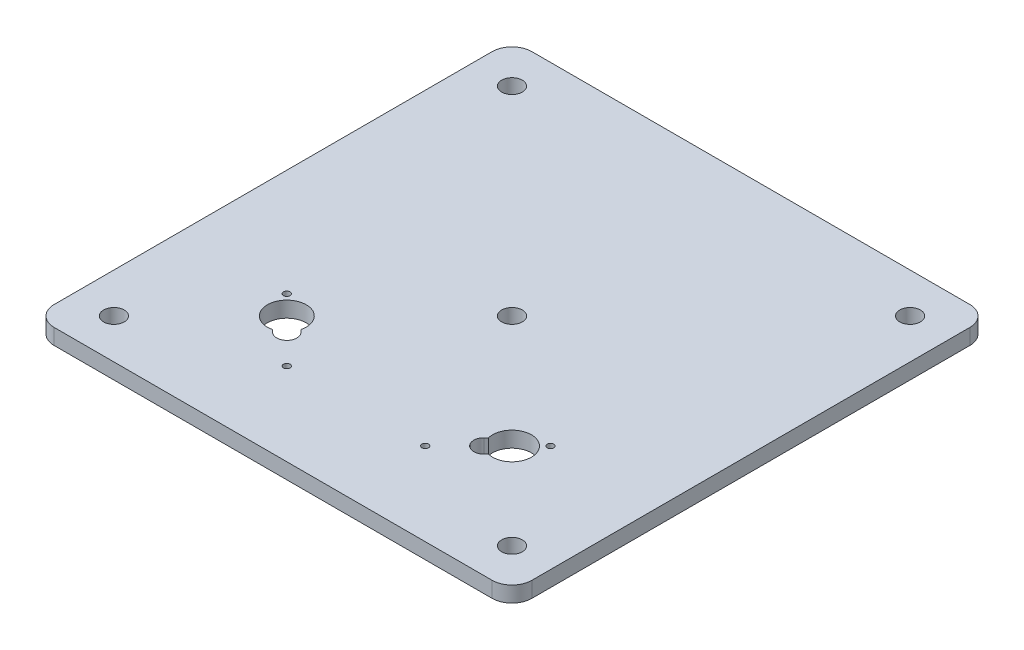
ISO-10303-21;
HEADER;
FILE_DESCRIPTION(('STEP AP214'),'2;1');
FILE_NAME('part.step','',(''),(''),'','','');
FILE_SCHEMA(('AUTOMOTIVE_DESIGN { 1 0 10303 214 1 1 1 1 }'));
ENDSEC;
DATA;
#1=APPLICATION_CONTEXT('core data for automotive mechanical design processes');
#2=APPLICATION_PROTOCOL_DEFINITION('international standard','automotive_design',2000,#1);
#3=PRODUCT_CONTEXT('',#1,'mechanical');
#4=PRODUCT('Part','Part','',(#3));
#5=PRODUCT_RELATED_PRODUCT_CATEGORY('part','',(#4));
#6=PRODUCT_DEFINITION_FORMATION('','',#4);
#7=PRODUCT_DEFINITION_CONTEXT('part definition',#1,'design');
#8=PRODUCT_DEFINITION('design','',#6,#7);
#9=PRODUCT_DEFINITION_SHAPE('','',#8);
#10=(LENGTH_UNIT() NAMED_UNIT(*) SI_UNIT(.MILLI.,.METRE.));
#11=(NAMED_UNIT(*) PLANE_ANGLE_UNIT() SI_UNIT($,.RADIAN.));
#12=(NAMED_UNIT(*) SI_UNIT($,.STERADIAN.) SOLID_ANGLE_UNIT());
#13=UNCERTAINTY_MEASURE_WITH_UNIT(LENGTH_MEASURE(1.E-05),#10,'distance_accuracy_value','');
#14=(GEOMETRIC_REPRESENTATION_CONTEXT(3) GLOBAL_UNCERTAINTY_ASSIGNED_CONTEXT((#13)) GLOBAL_UNIT_ASSIGNED_CONTEXT((#10,
#11,#12)) REPRESENTATION_CONTEXT('',''));
#15=CARTESIAN_POINT('',(0.,0.,0.));
#16=DIRECTION('',(0.,0.,1.));
#17=DIRECTION('',(1.,0.,0.));
#18=AXIS2_PLACEMENT_3D('',#15,#16,#17);
#19=CARTESIAN_POINT('',(-69.85,5.,69.85));
#20=DIRECTION('',(0.,1.,0.));
#21=DIRECTION('',(0.,0.,1.));
#22=AXIS2_PLACEMENT_3D('',#19,#20,#21);
#23=PLANE('',#22);
#24=CARTESIAN_POINT('',(-22.0794092425505,5.,49.7626397260038));
#25=DIRECTION('',(0.,1.,0.));
#26=DIRECTION('',(0.,0.,1.));
#27=AXIS2_PLACEMENT_3D('',#24,#25,#26);
#28=CIRCLE('',#27,1.05000000000001);
#29=CARTESIAN_POINT('',(-22.0794092425505,5.,50.8126397260038));
#30=VERTEX_POINT('',#29);
#31=EDGE_CURVE('E194',#30,#30,#28,.T.);
#32=ORIENTED_EDGE('',*,*,#31,.F.);
#33=EDGE_LOOP('',(#32));
#34=FACE_BOUND('',#33,.T.);
#35=CARTESIAN_POINT('',(42.0551758110702,5.,29.7868731574836));
#36=DIRECTION('',(0.,1.,0.));
#37=DIRECTION('',(0.,0.,-1.));
#38=AXIS2_PLACEMENT_3D('',#35,#36,#37);
#39=CIRCLE('',#38,1.05);
#40=CARTESIAN_POINT('',(42.0551758110702,5.,28.7368731574836));
#41=VERTEX_POINT('',#40);
#42=EDGE_CURVE('E206',#41,#41,#39,.T.);
#43=ORIENTED_EDGE('',*,*,#42,.F.);
#44=EDGE_LOOP('',(#43));
#45=FACE_BOUND('',#44,.T.);
#46=CARTESIAN_POINT('',(-63.5,5.,-63.5));
#47=DIRECTION('',(0.,1.,0.));
#48=DIRECTION('',(0.,0.,-1.));
#49=AXIS2_PLACEMENT_3D('',#46,#47,#48);
#50=CIRCLE('',#49,3.302);
#51=CARTESIAN_POINT('',(-63.5,5.,-66.802));
#52=VERTEX_POINT('',#51);
#53=EDGE_CURVE('E246',#52,#52,#50,.T.);
#54=ORIENTED_EDGE('',*,*,#53,.F.);
#55=EDGE_LOOP('',(#54));
#56=FACE_BOUND('',#55,.T.);
#57=CARTESIAN_POINT('',(63.5000000000001,5.,63.5));
#58=DIRECTION('',(0.,1.,0.));
#59=DIRECTION('',(0.,0.,-1.));
#60=AXIS2_PLACEMENT_3D('',#57,#58,#59);
#61=CIRCLE('',#60,3.302);
#62=CARTESIAN_POINT('',(63.5000000000001,5.,60.198));
#63=VERTEX_POINT('',#62);
#64=EDGE_CURVE('E258',#63,#63,#61,.T.);
#65=ORIENTED_EDGE('',*,*,#64,.F.);
#66=EDGE_LOOP('',(#65));
#67=FACE_BOUND('',#66,.T.);
#68=CARTESIAN_POINT('',(-69.85,5.,69.85));
#69=DIRECTION('',(0.,1.,0.));
#70=DIRECTION('',(0.,0.,1.));
#71=AXIS2_PLACEMENT_3D('',#68,#69,#70);
#72=CIRCLE('',#71,6.34999999999999);
#73=CARTESIAN_POINT('',(-76.2,5.,69.85));
#74=VERTEX_POINT('',#73);
#75=CARTESIAN_POINT('',(-69.85,5.,76.2));
#76=VERTEX_POINT('',#75);
#77=EDGE_CURVE('E270',#74,#76,#72,.T.);
#78=ORIENTED_EDGE('',*,*,#77,.T.);
#79=DIRECTION('',(1.,0.,0.));
#80=VECTOR('',#79,1.);
#81=CARTESIAN_POINT('',(-69.85,5.,76.2));
#82=LINE('',#81,#80);
#83=CARTESIAN_POINT('',(69.85,5.,76.2));
#84=VERTEX_POINT('',#83);
#85=EDGE_CURVE('E273',#76,#84,#82,.T.);
#86=ORIENTED_EDGE('',*,*,#85,.T.);
#87=CARTESIAN_POINT('',(69.85,5.,69.85));
#88=DIRECTION('',(0.,1.,0.));
#89=DIRECTION('',(0.,0.,1.));
#90=AXIS2_PLACEMENT_3D('',#87,#88,#89);
#91=CIRCLE('',#90,6.34999999999999);
#92=CARTESIAN_POINT('',(76.2,5.,69.85));
#93=VERTEX_POINT('',#92);
#94=EDGE_CURVE('E276',#84,#93,#91,.T.);
#95=ORIENTED_EDGE('',*,*,#94,.T.);
#96=DIRECTION('',(0.,0.,-1.));
#97=VECTOR('',#96,1.);
#98=CARTESIAN_POINT('',(76.2,5.,-69.85));
#99=LINE('',#98,#97);
#100=CARTESIAN_POINT('',(76.2,5.,-69.85));
#101=VERTEX_POINT('',#100);
#102=EDGE_CURVE('E278',#93,#101,#99,.T.);
#103=ORIENTED_EDGE('',*,*,#102,.T.);
#104=CARTESIAN_POINT('',(69.85,5.,-69.85));
#105=DIRECTION('',(0.,1.,0.));
#106=DIRECTION('',(0.,0.,-1.));
#107=AXIS2_PLACEMENT_3D('',#104,#105,#106);
#108=CIRCLE('',#107,6.34999999999999);
#109=CARTESIAN_POINT('',(69.8499999999999,5.,-76.2));
#110=VERTEX_POINT('',#109);
#111=EDGE_CURVE('E280',#101,#110,#108,.T.);
#112=ORIENTED_EDGE('',*,*,#111,.T.);
#113=DIRECTION('',(-1.,0.,0.));
#114=VECTOR('',#113,1.);
#115=CARTESIAN_POINT('',(-69.85,5.,-76.2));
#116=LINE('',#115,#114);
#117=CARTESIAN_POINT('',(-69.85,5.,-76.2));
#118=VERTEX_POINT('',#117);
#119=EDGE_CURVE('E282',#110,#118,#116,.T.);
#120=ORIENTED_EDGE('',*,*,#119,.T.);
#121=CARTESIAN_POINT('',(-69.8500000000001,5.,-69.85));
#122=DIRECTION('',(0.,1.,0.));
#123=DIRECTION('',(0.,0.,1.));
#124=AXIS2_PLACEMENT_3D('',#121,#122,#123);
#125=CIRCLE('',#124,6.34999999999999);
#126=CARTESIAN_POINT('',(-76.2,5.,-69.85));
#127=VERTEX_POINT('',#126);
#128=EDGE_CURVE('E284',#118,#127,#125,.T.);
#129=ORIENTED_EDGE('',*,*,#128,.T.);
#130=DIRECTION('',(0.,0.,1.));
#131=VECTOR('',#130,1.);
#132=CARTESIAN_POINT('',(-76.2,5.,-69.85));
#133=LINE('',#132,#131);
#134=EDGE_CURVE('E286',#127,#74,#133,.T.);
#135=ORIENTED_EDGE('',*,*,#134,.T.);
#136=EDGE_LOOP('',(#78,#86,#95,#103,#112,#120,#129,#135));
#137=FACE_BOUND('',#136,.T.);
#138=CARTESIAN_POINT('',(63.5000000000001,5.,-63.5));
#139=DIRECTION('',(0.,1.,0.));
#140=DIRECTION('',(0.,0.,1.));
#141=AXIS2_PLACEMENT_3D('',#138,#139,#140);
#142=CIRCLE('',#141,3.302);
#143=CARTESIAN_POINT('',(63.5000000000001,5.,-60.198));
#144=VERTEX_POINT('',#143);
#145=EDGE_CURVE('E264',#144,#144,#142,.T.);
#146=ORIENTED_EDGE('',*,*,#145,.F.);
#147=EDGE_LOOP('',(#146));
#148=FACE_BOUND('',#147,.T.);
#149=CARTESIAN_POINT('',(-63.5,5.,63.5));
#150=DIRECTION('',(0.,1.,0.));
#151=DIRECTION('',(0.,0.,1.));
#152=AXIS2_PLACEMENT_3D('',#149,#150,#151);
#153=CIRCLE('',#152,3.302);
#154=CARTESIAN_POINT('',(-63.5,5.,66.802));
#155=VERTEX_POINT('',#154);
#156=EDGE_CURVE('E252',#155,#155,#153,.T.);
#157=ORIENTED_EDGE('',*,*,#156,.F.);
#158=EDGE_LOOP('',(#157));
#159=FACE_BOUND('',#158,.T.);
#160=CARTESIAN_POINT('',(0.,5.,0.));
#161=DIRECTION('',(0.,1.,0.));
#162=DIRECTION('',(0.,0.,1.));
#163=AXIS2_PLACEMENT_3D('',#160,#161,#162);
#164=CIRCLE('',#163,3.302);
#165=CARTESIAN_POINT('',(0.,5.,3.30199999999997));
#166=VERTEX_POINT('',#165);
#167=EDGE_CURVE('E240',#166,#166,#164,.T.);
#168=ORIENTED_EDGE('',*,*,#167,.F.);
#169=EDGE_LOOP('',(#168));
#170=FACE_BOUND('',#169,.T.);
#171=DIRECTION('',(0.707106781186548,0.,0.707106781186548));
#172=VECTOR('',#171,1.);
#173=CARTESIAN_POINT('',(-33.6936381235396,5.,42.6738942446087));
#174=LINE('',#173,#172);
#175=CARTESIAN_POINT('',(-34.4287695129708,5.,41.9387628551775));
#176=VERTEX_POINT('',#175);
#177=CARTESIAN_POINT('',(-33.6936381235396,5.,42.6738942446087));
#178=VERTEX_POINT('',#177);
#179=EDGE_CURVE('E213',#176,#178,#174,.T.);
#180=ORIENTED_EDGE('',*,*,#179,.F.);
#181=CARTESIAN_POINT('',(-35.9210244842766,5.,35.9210244842766));
#182=DIRECTION('',(0.,1.,0.));
#183=DIRECTION('',(0.,0.,1.));
#184=AXIS2_PLACEMENT_3D('',#181,#182,#183);
#185=CIRCLE('',#184,6.2);
#186=CARTESIAN_POINT('',(-29.9032861133761,5.,37.4132794555841));
#187=VERTEX_POINT('',#186);
#188=EDGE_CURVE('E211',#187,#176,#185,.T.);
#189=ORIENTED_EDGE('',*,*,#188,.F.);
#190=DIRECTION('',(-0.707106781186497,0.,-0.707106781186598));
#191=VECTOR('',#190,1.);
#192=CARTESIAN_POINT('',(-29.1681547239456,5.,38.1484108450147));
#193=LINE('',#192,#191);
#194=CARTESIAN_POINT('',(-29.1681547239456,5.,38.1484108450147));
#195=VERTEX_POINT('',#194);
#196=EDGE_CURVE('E218',#195,#187,#193,.T.);
#197=ORIENTED_EDGE('',*,*,#196,.F.);
#198=CARTESIAN_POINT('',(-31.4308964237426,5.,40.4111525448117));
#199=DIRECTION('',(0.,1.,0.));
#200=DIRECTION('',(0.,0.,1.));
#201=AXIS2_PLACEMENT_3D('',#198,#199,#200);
#202=CIRCLE('',#201,3.20000000000005);
#203=EDGE_CURVE('E216',#178,#195,#202,.T.);
#204=ORIENTED_EDGE('',*,*,#203,.F.);
#205=EDGE_LOOP('',(#180,#189,#197,#204));
#206=FACE_BOUND('',#205,.T.);
#207=DIRECTION('',(-0.707106781186497,0.,0.707106781186598));
#208=VECTOR('',#207,1.);
#209=CARTESIAN_POINT('',(29.1681547239456,5.,38.1484108450147));
#210=LINE('',#209,#208);
#211=CARTESIAN_POINT('',(29.9032861133761,5.,37.4132794555841));
#212=VERTEX_POINT('',#211);
#213=CARTESIAN_POINT('',(29.1681547239456,5.,38.1484108450147));
#214=VERTEX_POINT('',#213);
#215=EDGE_CURVE('E157',#212,#214,#210,.T.);
#216=ORIENTED_EDGE('',*,*,#215,.F.);
#217=CARTESIAN_POINT('',(35.9210244842766,5.,35.9210244842766));
#218=DIRECTION('',(0.,1.,0.));
#219=DIRECTION('',(0.,0.,-1.));
#220=AXIS2_PLACEMENT_3D('',#217,#218,#219);
#221=CIRCLE('',#220,6.2);
#222=CARTESIAN_POINT('',(34.4287695129707,5.,41.9387628551775));
#223=VERTEX_POINT('',#222);
#224=EDGE_CURVE('E147',#223,#212,#221,.T.);
#225=ORIENTED_EDGE('',*,*,#224,.F.);
#226=DIRECTION('',(0.707106781186548,0.,-0.707106781186548));
#227=VECTOR('',#226,1.);
#228=CARTESIAN_POINT('',(33.6936381235395,5.,42.6738942446087));
#229=LINE('',#228,#227);
#230=CARTESIAN_POINT('',(33.6936381235396,5.,42.6738942446087));
#231=VERTEX_POINT('',#230);
#232=EDGE_CURVE('E172',#231,#223,#229,.T.);
#233=ORIENTED_EDGE('',*,*,#232,.F.);
#234=CARTESIAN_POINT('',(31.4308964237426,5.,40.4111525448117));
#235=DIRECTION('',(0.,1.,0.));
#236=DIRECTION('',(0.,0.,-1.));
#237=AXIS2_PLACEMENT_3D('',#234,#235,#236);
#238=CIRCLE('',#237,3.20000000000005);
#239=EDGE_CURVE('E170',#214,#231,#238,.T.);
#240=ORIENTED_EDGE('',*,*,#239,.F.);
#241=EDGE_LOOP('',(#216,#225,#233,#240));
#242=FACE_BOUND('',#241,.T.);
#243=CARTESIAN_POINT('',(22.0794092425502,5.,49.7626397260035));
#244=DIRECTION('',(0.,1.,0.));
#245=DIRECTION('',(0.,0.,-1.));
#246=AXIS2_PLACEMENT_3D('',#243,#244,#245);
#247=CIRCLE('',#246,1.05);
#248=CARTESIAN_POINT('',(22.0794092425502,5.,48.7126397260035));
#249=VERTEX_POINT('',#248);
#250=EDGE_CURVE('E200',#249,#249,#247,.T.);
#251=ORIENTED_EDGE('',*,*,#250,.F.);
#252=EDGE_LOOP('',(#251));
#253=FACE_BOUND('',#252,.T.);
#254=CARTESIAN_POINT('',(-42.0551758110705,5.,29.7868731574839));
#255=DIRECTION('',(0.,1.,0.));
#256=DIRECTION('',(0.,0.,1.));
#257=AXIS2_PLACEMENT_3D('',#254,#255,#256);
#258=CIRCLE('',#257,1.05000000000001);
#259=CARTESIAN_POINT('',(-42.0551758110705,5.,30.8368731574839));
#260=VERTEX_POINT('',#259);
#261=EDGE_CURVE('E187',#260,#260,#258,.T.);
#262=ORIENTED_EDGE('',*,*,#261,.F.);
#263=EDGE_LOOP('',(#262));
#264=FACE_BOUND('',#263,.T.);
#265=ADVANCED_FACE('F33',(#34,#45,#56,#67,#137,#148,#159,#170,#206,#242,#253,#264),#23,.T.);
#266=CARTESIAN_POINT('',(-69.85,0.,69.85));
#267=DIRECTION('',(0.,1.,0.));
#268=DIRECTION('',(0.,0.,1.));
#269=AXIS2_PLACEMENT_3D('',#266,#267,#268);
#270=PLANE('',#269);
#271=CARTESIAN_POINT('',(-35.9210244842766,0.,35.9210244842766));
#272=DIRECTION('',(0.,1.,0.));
#273=DIRECTION('',(0.,0.,1.));
#274=AXIS2_PLACEMENT_3D('',#271,#272,#273);
#275=CIRCLE('',#274,6.2);
#276=CARTESIAN_POINT('',(-29.9032861133761,0.,37.4132794555841));
#277=VERTEX_POINT('',#276);
#278=CARTESIAN_POINT('',(-34.4287695129708,0.,41.9387628551775));
#279=VERTEX_POINT('',#278);
#280=EDGE_CURVE('E190',#277,#279,#275,.T.);
#281=ORIENTED_EDGE('',*,*,#280,.T.);
#282=DIRECTION('',(0.707106781186548,0.,0.707106781186548));
#283=VECTOR('',#282,1.);
#284=CARTESIAN_POINT('',(-33.6936381235396,0.,42.6738942446087));
#285=LINE('',#284,#283);
#286=CARTESIAN_POINT('',(-33.6936381235396,0.,42.6738942446087));
#287=VERTEX_POINT('',#286);
#288=EDGE_CURVE('E223',#279,#287,#285,.T.);
#289=ORIENTED_EDGE('',*,*,#288,.T.);
#290=CARTESIAN_POINT('',(-31.4308964237426,0.,40.4111525448117));
#291=DIRECTION('',(0.,1.,0.));
#292=DIRECTION('',(0.,0.,1.));
#293=AXIS2_PLACEMENT_3D('',#290,#291,#292);
#294=CIRCLE('',#293,3.20000000000005);
#295=CARTESIAN_POINT('',(-29.1681547239456,0.,38.1484108450147));
#296=VERTEX_POINT('',#295);
#297=EDGE_CURVE('E226',#287,#296,#294,.T.);
#298=ORIENTED_EDGE('',*,*,#297,.T.);
#299=DIRECTION('',(-0.707106781186497,0.,-0.707106781186598));
#300=VECTOR('',#299,1.);
#301=CARTESIAN_POINT('',(-29.1681547239456,0.,38.1484108450147));
#302=LINE('',#301,#300);
#303=EDGE_CURVE('E214',#296,#277,#302,.T.);
#304=ORIENTED_EDGE('',*,*,#303,.T.);
#305=EDGE_LOOP('',(#281,#289,#298,#304));
#306=FACE_BOUND('',#305,.T.);
#307=CARTESIAN_POINT('',(-69.85,0.,69.85));
#308=DIRECTION('',(0.,1.,0.));
#309=DIRECTION('',(0.,0.,1.));
#310=AXIS2_PLACEMENT_3D('',#307,#308,#309);
#311=CIRCLE('',#310,6.34999999999999);
#312=CARTESIAN_POINT('',(-76.2,0.,69.85));
#313=VERTEX_POINT('',#312);
#314=CARTESIAN_POINT('',(-69.85,0.,76.2));
#315=VERTEX_POINT('',#314);
#316=EDGE_CURVE('E267',#313,#315,#311,.T.);
#317=ORIENTED_EDGE('',*,*,#316,.F.);
#318=DIRECTION('',(0.,0.,1.));
#319=VECTOR('',#318,1.);
#320=CARTESIAN_POINT('',(-76.2,0.,-69.85));
#321=LINE('',#320,#319);
#322=CARTESIAN_POINT('',(-76.2,0.,-69.85));
#323=VERTEX_POINT('',#322);
#324=EDGE_CURVE('E274',#323,#313,#321,.T.);
#325=ORIENTED_EDGE('',*,*,#324,.F.);
#326=CARTESIAN_POINT('',(-69.8500000000001,0.,-69.85));
#327=DIRECTION('',(0.,1.,0.));
#328=DIRECTION('',(0.,0.,1.));
#329=AXIS2_PLACEMENT_3D('',#326,#327,#328);
#330=CIRCLE('',#329,6.34999999999999);
#331=CARTESIAN_POINT('',(-69.85,0.,-76.2));
#332=VERTEX_POINT('',#331);
#333=EDGE_CURVE('E301',#332,#323,#330,.T.);
#334=ORIENTED_EDGE('',*,*,#333,.F.);
#335=DIRECTION('',(-1.,0.,0.));
#336=VECTOR('',#335,1.);
#337=CARTESIAN_POINT('',(-69.85,0.,-76.2));
#338=LINE('',#337,#336);
#339=CARTESIAN_POINT('',(69.8499999999999,0.,-76.2));
#340=VERTEX_POINT('',#339);
#341=EDGE_CURVE('E299',#340,#332,#338,.T.);
#342=ORIENTED_EDGE('',*,*,#341,.F.);
#343=CARTESIAN_POINT('',(69.85,0.,-69.85));
#344=DIRECTION('',(0.,1.,0.));
#345=DIRECTION('',(0.,0.,-1.));
#346=AXIS2_PLACEMENT_3D('',#343,#344,#345);
#347=CIRCLE('',#346,6.34999999999999);
#348=CARTESIAN_POINT('',(76.2,0.,-69.85));
#349=VERTEX_POINT('',#348);
#350=EDGE_CURVE('E297',#349,#340,#347,.T.);
#351=ORIENTED_EDGE('',*,*,#350,.F.);
#352=DIRECTION('',(0.,0.,-1.));
#353=VECTOR('',#352,1.);
#354=CARTESIAN_POINT('',(76.2,0.,-69.85));
#355=LINE('',#354,#353);
#356=CARTESIAN_POINT('',(76.2,0.,69.85));
#357=VERTEX_POINT('',#356);
#358=EDGE_CURVE('E295',#357,#349,#355,.T.);
#359=ORIENTED_EDGE('',*,*,#358,.F.);
#360=CARTESIAN_POINT('',(69.85,0.,69.85));
#361=DIRECTION('',(0.,1.,0.));
#362=DIRECTION('',(0.,0.,1.));
#363=AXIS2_PLACEMENT_3D('',#360,#361,#362);
#364=CIRCLE('',#363,6.34999999999999);
#365=CARTESIAN_POINT('',(69.85,0.,76.2));
#366=VERTEX_POINT('',#365);
#367=EDGE_CURVE('E293',#366,#357,#364,.T.);
#368=ORIENTED_EDGE('',*,*,#367,.F.);
#369=DIRECTION('',(1.,0.,0.));
#370=VECTOR('',#369,1.);
#371=CARTESIAN_POINT('',(-69.85,0.,76.2));
#372=LINE('',#371,#370);
#373=EDGE_CURVE('E291',#315,#366,#372,.T.);
#374=ORIENTED_EDGE('',*,*,#373,.F.);
#375=EDGE_LOOP('',(#317,#325,#334,#342,#351,#359,#368,#374));
#376=FACE_BOUND('',#375,.T.);
#377=CARTESIAN_POINT('',(63.5000000000001,0.,-63.5));
#378=DIRECTION('',(0.,1.,0.));
#379=DIRECTION('',(0.,0.,1.));
#380=AXIS2_PLACEMENT_3D('',#377,#378,#379);
#381=CIRCLE('',#380,3.302);
#382=CARTESIAN_POINT('',(63.5000000000001,0.,-60.198));
#383=VERTEX_POINT('',#382);
#384=EDGE_CURVE('E261',#383,#383,#381,.T.);
#385=ORIENTED_EDGE('',*,*,#384,.T.);
#386=EDGE_LOOP('',(#385));
#387=FACE_BOUND('',#386,.T.);
#388=CARTESIAN_POINT('',(63.5000000000001,0.,63.5));
#389=DIRECTION('',(0.,1.,0.));
#390=DIRECTION('',(0.,0.,-1.));
#391=AXIS2_PLACEMENT_3D('',#388,#389,#390);
#392=CIRCLE('',#391,3.302);
#393=CARTESIAN_POINT('',(63.5000000000001,0.,60.198));
#394=VERTEX_POINT('',#393);
#395=EDGE_CURVE('E255',#394,#394,#392,.T.);
#396=ORIENTED_EDGE('',*,*,#395,.T.);
#397=EDGE_LOOP('',(#396));
#398=FACE_BOUND('',#397,.T.);
#399=CARTESIAN_POINT('',(-63.5,0.,63.5));
#400=DIRECTION('',(0.,1.,0.));
#401=DIRECTION('',(0.,0.,1.));
#402=AXIS2_PLACEMENT_3D('',#399,#400,#401);
#403=CIRCLE('',#402,3.302);
#404=CARTESIAN_POINT('',(-63.5,0.,66.802));
#405=VERTEX_POINT('',#404);
#406=EDGE_CURVE('E249',#405,#405,#403,.T.);
#407=ORIENTED_EDGE('',*,*,#406,.T.);
#408=EDGE_LOOP('',(#407));
#409=FACE_BOUND('',#408,.T.);
#410=CARTESIAN_POINT('',(-63.5,0.,-63.5));
#411=DIRECTION('',(0.,1.,0.));
#412=DIRECTION('',(0.,0.,-1.));
#413=AXIS2_PLACEMENT_3D('',#410,#411,#412);
#414=CIRCLE('',#413,3.302);
#415=CARTESIAN_POINT('',(-63.5,0.,-66.802));
#416=VERTEX_POINT('',#415);
#417=EDGE_CURVE('E243',#416,#416,#414,.T.);
#418=ORIENTED_EDGE('',*,*,#417,.T.);
#419=EDGE_LOOP('',(#418));
#420=FACE_BOUND('',#419,.T.);
#421=CARTESIAN_POINT('',(0.,0.,0.));
#422=DIRECTION('',(0.,1.,0.));
#423=DIRECTION('',(0.,0.,1.));
#424=AXIS2_PLACEMENT_3D('',#421,#422,#423);
#425=CIRCLE('',#424,3.302);
#426=CARTESIAN_POINT('',(0.,0.,3.30199999999997));
#427=VERTEX_POINT('',#426);
#428=EDGE_CURVE('E239',#427,#427,#425,.T.);
#429=ORIENTED_EDGE('',*,*,#428,.T.);
#430=EDGE_LOOP('',(#429));
#431=FACE_BOUND('',#430,.T.);
#432=CARTESIAN_POINT('',(35.9210244842766,0.,35.9210244842766));
#433=DIRECTION('',(0.,1.,0.));
#434=DIRECTION('',(0.,0.,-1.));
#435=AXIS2_PLACEMENT_3D('',#432,#433,#434);
#436=CIRCLE('',#435,6.2);
#437=CARTESIAN_POINT('',(34.4287695129707,0.,41.9387628551775));
#438=VERTEX_POINT('',#437);
#439=CARTESIAN_POINT('',(29.9032861133761,0.,37.4132794555841));
#440=VERTEX_POINT('',#439);
#441=EDGE_CURVE('E176',#438,#440,#436,.T.);
#442=ORIENTED_EDGE('',*,*,#441,.T.);
#443=DIRECTION('',(-0.707106781186497,0.,0.707106781186598));
#444=VECTOR('',#443,1.);
#445=CARTESIAN_POINT('',(29.1681547239456,0.,38.1484108450147));
#446=LINE('',#445,#444);
#447=CARTESIAN_POINT('',(29.1681547239456,0.,38.1484108450147));
#448=VERTEX_POINT('',#447);
#449=EDGE_CURVE('E164',#440,#448,#446,.T.);
#450=ORIENTED_EDGE('',*,*,#449,.T.);
#451=CARTESIAN_POINT('',(31.4308964237426,0.,40.4111525448117));
#452=DIRECTION('',(0.,1.,0.));
#453=DIRECTION('',(0.,0.,-1.));
#454=AXIS2_PLACEMENT_3D('',#451,#452,#453);
#455=CIRCLE('',#454,3.20000000000005);
#456=CARTESIAN_POINT('',(33.6936381235396,0.,42.6738942446087));
#457=VERTEX_POINT('',#456);
#458=EDGE_CURVE('E179',#448,#457,#455,.T.);
#459=ORIENTED_EDGE('',*,*,#458,.T.);
#460=DIRECTION('',(0.707106781186548,0.,-0.707106781186548));
#461=VECTOR('',#460,1.);
#462=CARTESIAN_POINT('',(33.6936381235395,0.,42.6738942446087));
#463=LINE('',#462,#461);
#464=EDGE_CURVE('E158',#457,#438,#463,.T.);
#465=ORIENTED_EDGE('',*,*,#464,.T.);
#466=EDGE_LOOP('',(#442,#450,#459,#465));
#467=FACE_BOUND('',#466,.T.);
#468=CARTESIAN_POINT('',(42.0551758110702,0.,29.7868731574836));
#469=DIRECTION('',(0.,1.,0.));
#470=DIRECTION('',(0.,0.,-1.));
#471=AXIS2_PLACEMENT_3D('',#468,#469,#470);
#472=CIRCLE('',#471,1.05);
#473=CARTESIAN_POINT('',(42.0551758110702,0.,28.7368731574836));
#474=VERTEX_POINT('',#473);
#475=EDGE_CURVE('E165',#474,#474,#472,.T.);
#476=ORIENTED_EDGE('',*,*,#475,.T.);
#477=EDGE_LOOP('',(#476));
#478=FACE_BOUND('',#477,.T.);
#479=CARTESIAN_POINT('',(22.0794092425502,0.,49.7626397260035));
#480=DIRECTION('',(0.,1.,0.));
#481=DIRECTION('',(0.,0.,-1.));
#482=AXIS2_PLACEMENT_3D('',#479,#480,#481);
#483=CIRCLE('',#482,1.05);
#484=CARTESIAN_POINT('',(22.0794092425502,0.,48.7126397260035));
#485=VERTEX_POINT('',#484);
#486=EDGE_CURVE('E203',#485,#485,#483,.T.);
#487=ORIENTED_EDGE('',*,*,#486,.T.);
#488=EDGE_LOOP('',(#487));
#489=FACE_BOUND('',#488,.T.);
#490=CARTESIAN_POINT('',(-22.0794092425505,0.,49.7626397260038));
#491=DIRECTION('',(0.,1.,0.));
#492=DIRECTION('',(0.,0.,1.));
#493=AXIS2_PLACEMENT_3D('',#490,#491,#492);
#494=CIRCLE('',#493,1.05000000000001);
#495=CARTESIAN_POINT('',(-22.0794092425505,0.,50.8126397260038));
#496=VERTEX_POINT('',#495);
#497=EDGE_CURVE('E197',#496,#496,#494,.T.);
#498=ORIENTED_EDGE('',*,*,#497,.T.);
#499=EDGE_LOOP('',(#498));
#500=FACE_BOUND('',#499,.T.);
#501=CARTESIAN_POINT('',(-42.0551758110705,0.,29.7868731574839));
#502=DIRECTION('',(0.,1.,0.));
#503=DIRECTION('',(0.,0.,1.));
#504=AXIS2_PLACEMENT_3D('',#501,#502,#503);
#505=CIRCLE('',#504,1.05000000000001);
#506=CARTESIAN_POINT('',(-42.0551758110705,0.,30.8368731574839));
#507=VERTEX_POINT('',#506);
#508=EDGE_CURVE('E191',#507,#507,#505,.T.);
#509=ORIENTED_EDGE('',*,*,#508,.T.);
#510=EDGE_LOOP('',(#509));
#511=FACE_BOUND('',#510,.T.);
#512=ADVANCED_FACE('F331',(#306,#376,#387,#398,#409,#420,#431,#467,#478,#489,#500,#511),#270,.F.);
#513=CARTESIAN_POINT('',(-69.85,5.,69.85));
#514=DIRECTION('',(0.,-1.,0.));
#515=DIRECTION('',(0.,0.,-1.));
#516=AXIS2_PLACEMENT_3D('',#513,#514,#515);
#517=CYLINDRICAL_SURFACE('',#516,6.34999999999999);
#518=ORIENTED_EDGE('',*,*,#316,.T.);
#519=DIRECTION('',(0.,-1.,0.));
#520=VECTOR('',#519,1.);
#521=CARTESIAN_POINT('',(-69.85,5.,76.2));
#522=LINE('',#521,#520);
#523=EDGE_CURVE('E11',#76,#315,#522,.T.);
#524=ORIENTED_EDGE('',*,*,#523,.F.);
#525=ORIENTED_EDGE('',*,*,#77,.F.);
#526=DIRECTION('',(0.,-1.,0.));
#527=VECTOR('',#526,1.);
#528=CARTESIAN_POINT('',(-76.2,5.,69.85));
#529=LINE('',#528,#527);
#530=EDGE_CURVE('E288',#74,#313,#529,.T.);
#531=ORIENTED_EDGE('',*,*,#530,.T.);
#532=EDGE_LOOP('',(#518,#524,#525,#531));
#533=FACE_BOUND('',#532,.T.);
#534=ADVANCED_FACE('F35',(#533),#517,.T.);
#535=CARTESIAN_POINT('',(-69.85,5.,76.2));
#536=DIRECTION('',(0.,0.,-1.));
#537=DIRECTION('',(-1.,0.,0.));
#538=AXIS2_PLACEMENT_3D('',#535,#536,#537);
#539=PLANE('',#538);
#540=ORIENTED_EDGE('',*,*,#373,.T.);
#541=DIRECTION('',(0.,-1.,0.));
#542=VECTOR('',#541,1.);
#543=CARTESIAN_POINT('',(69.85,5.,76.2));
#544=LINE('',#543,#542);
#545=EDGE_CURVE('E41',#84,#366,#544,.T.);
#546=ORIENTED_EDGE('',*,*,#545,.F.);
#547=ORIENTED_EDGE('',*,*,#85,.F.);
#548=ORIENTED_EDGE('',*,*,#523,.T.);
#549=EDGE_LOOP('',(#540,#546,#547,#548));
#550=FACE_BOUND('',#549,.T.);
#551=ADVANCED_FACE('F349',(#550),#539,.F.);
#552=CARTESIAN_POINT('',(69.85,5.,69.85));
#553=DIRECTION('',(0.,-1.,0.));
#554=DIRECTION('',(0.,0.,-1.));
#555=AXIS2_PLACEMENT_3D('',#552,#553,#554);
#556=CYLINDRICAL_SURFACE('',#555,6.34999999999999);
#557=ORIENTED_EDGE('',*,*,#367,.T.);
#558=DIRECTION('',(0.,-1.,0.));
#559=VECTOR('',#558,1.);
#560=CARTESIAN_POINT('',(76.2,5.,69.85));
#561=LINE('',#560,#559);
#562=EDGE_CURVE('E318',#93,#357,#561,.T.);
#563=ORIENTED_EDGE('',*,*,#562,.F.);
#564=ORIENTED_EDGE('',*,*,#94,.F.);
#565=ORIENTED_EDGE('',*,*,#545,.T.);
#566=EDGE_LOOP('',(#557,#563,#564,#565));
#567=FACE_BOUND('',#566,.T.);
#568=ADVANCED_FACE('F325',(#567),#556,.T.);
#569=CARTESIAN_POINT('',(76.2,5.,-69.85));
#570=DIRECTION('',(-1.,0.,0.));
#571=DIRECTION('',(0.,0.,1.));
#572=AXIS2_PLACEMENT_3D('',#569,#570,#571);
#573=PLANE('',#572);
#574=ORIENTED_EDGE('',*,*,#358,.T.);
#575=DIRECTION('',(0.,-1.,0.));
#576=VECTOR('',#575,1.);
#577=CARTESIAN_POINT('',(76.2,5.,-69.85));
#578=LINE('',#577,#576);
#579=EDGE_CURVE('E315',#101,#349,#578,.T.);
#580=ORIENTED_EDGE('',*,*,#579,.F.);
#581=ORIENTED_EDGE('',*,*,#102,.F.);
#582=ORIENTED_EDGE('',*,*,#562,.T.);
#583=EDGE_LOOP('',(#574,#580,#581,#582));
#584=FACE_BOUND('',#583,.T.);
#585=ADVANCED_FACE('F337',(#584),#573,.F.);
#586=CARTESIAN_POINT('',(69.85,5.,-69.85));
#587=DIRECTION('',(0.,-1.,0.));
#588=DIRECTION('',(0.,0.,-1.));
#589=AXIS2_PLACEMENT_3D('',#586,#587,#588);
#590=CYLINDRICAL_SURFACE('',#589,6.34999999999999);
#591=ORIENTED_EDGE('',*,*,#350,.T.);
#592=DIRECTION('',(0.,-1.,0.));
#593=VECTOR('',#592,1.);
#594=CARTESIAN_POINT('',(69.8499999999999,5.,-76.2));
#595=LINE('',#594,#593);
#596=EDGE_CURVE('E312',#110,#340,#595,.T.);
#597=ORIENTED_EDGE('',*,*,#596,.F.);
#598=ORIENTED_EDGE('',*,*,#111,.F.);
#599=ORIENTED_EDGE('',*,*,#579,.T.);
#600=EDGE_LOOP('',(#591,#597,#598,#599));
#601=FACE_BOUND('',#600,.T.);
#602=ADVANCED_FACE('F341',(#601),#590,.T.);
#603=CARTESIAN_POINT('',(-69.85,5.,-76.2));
#604=DIRECTION('',(0.,0.,1.));
#605=DIRECTION('',(1.,0.,0.));
#606=AXIS2_PLACEMENT_3D('',#603,#604,#605);
#607=PLANE('',#606);
#608=ORIENTED_EDGE('',*,*,#341,.T.);
#609=DIRECTION('',(0.,-1.,0.));
#610=VECTOR('',#609,1.);
#611=CARTESIAN_POINT('',(-69.85,5.,-76.2));
#612=LINE('',#611,#610);
#613=EDGE_CURVE('E309',#118,#332,#612,.T.);
#614=ORIENTED_EDGE('',*,*,#613,.F.);
#615=ORIENTED_EDGE('',*,*,#119,.F.);
#616=ORIENTED_EDGE('',*,*,#596,.T.);
#617=EDGE_LOOP('',(#608,#614,#615,#616));
#618=FACE_BOUND('',#617,.T.);
#619=ADVANCED_FACE('F362',(#618),#607,.F.);
#620=CARTESIAN_POINT('',(-69.8500000000001,5.,-69.85));
#621=DIRECTION('',(0.,-1.,0.));
#622=DIRECTION('',(0.,0.,-1.));
#623=AXIS2_PLACEMENT_3D('',#620,#621,#622);
#624=CYLINDRICAL_SURFACE('',#623,6.34999999999999);
#625=ORIENTED_EDGE('',*,*,#333,.T.);
#626=DIRECTION('',(0.,-1.,0.));
#627=VECTOR('',#626,1.);
#628=CARTESIAN_POINT('',(-76.2,5.,-69.85));
#629=LINE('',#628,#627);
#630=EDGE_CURVE('E306',#127,#323,#629,.T.);
#631=ORIENTED_EDGE('',*,*,#630,.F.);
#632=ORIENTED_EDGE('',*,*,#128,.F.);
#633=ORIENTED_EDGE('',*,*,#613,.T.);
#634=EDGE_LOOP('',(#625,#631,#632,#633));
#635=FACE_BOUND('',#634,.T.);
#636=ADVANCED_FACE('F360',(#635),#624,.T.);
#637=CARTESIAN_POINT('',(-76.2,5.,-69.85));
#638=DIRECTION('',(1.,0.,0.));
#639=DIRECTION('',(0.,0.,-1.));
#640=AXIS2_PLACEMENT_3D('',#637,#638,#639);
#641=PLANE('',#640);
#642=ORIENTED_EDGE('',*,*,#324,.T.);
#643=ORIENTED_EDGE('',*,*,#530,.F.);
#644=ORIENTED_EDGE('',*,*,#134,.F.);
#645=ORIENTED_EDGE('',*,*,#630,.T.);
#646=EDGE_LOOP('',(#642,#643,#644,#645));
#647=FACE_BOUND('',#646,.T.);
#648=ADVANCED_FACE('F355',(#647),#641,.F.);
#649=CARTESIAN_POINT('',(63.5000000000001,5.,-63.5));
#650=DIRECTION('',(0.,-1.,0.));
#651=DIRECTION('',(0.,0.,-1.));
#652=AXIS2_PLACEMENT_3D('',#649,#650,#651);
#653=CYLINDRICAL_SURFACE('',#652,3.302);
#654=ORIENTED_EDGE('',*,*,#145,.T.);
#655=EDGE_LOOP('',(#654));
#656=FACE_BOUND('',#655,.T.);
#657=ORIENTED_EDGE('',*,*,#384,.F.);
#658=EDGE_LOOP('',(#657));
#659=FACE_BOUND('',#658,.T.);
#660=ADVANCED_FACE('F382',(#656,#659),#653,.F.);
#661=CARTESIAN_POINT('',(63.5000000000001,5.,63.5));
#662=DIRECTION('',(0.,-1.,0.));
#663=DIRECTION('',(0.,0.,-1.));
#664=AXIS2_PLACEMENT_3D('',#661,#662,#663);
#665=CYLINDRICAL_SURFACE('',#664,3.302);
#666=ORIENTED_EDGE('',*,*,#64,.T.);
#667=EDGE_LOOP('',(#666));
#668=FACE_BOUND('',#667,.T.);
#669=ORIENTED_EDGE('',*,*,#395,.F.);
#670=EDGE_LOOP('',(#669));
#671=FACE_BOUND('',#670,.T.);
#672=ADVANCED_FACE('F389',(#668,#671),#665,.F.);
#673=CARTESIAN_POINT('',(-63.5,5.,63.5));
#674=DIRECTION('',(0.,-1.,0.));
#675=DIRECTION('',(0.,0.,-1.));
#676=AXIS2_PLACEMENT_3D('',#673,#674,#675);
#677=CYLINDRICAL_SURFACE('',#676,3.302);
#678=ORIENTED_EDGE('',*,*,#156,.T.);
#679=EDGE_LOOP('',(#678));
#680=FACE_BOUND('',#679,.T.);
#681=ORIENTED_EDGE('',*,*,#406,.F.);
#682=EDGE_LOOP('',(#681));
#683=FACE_BOUND('',#682,.T.);
#684=ADVANCED_FACE('F394',(#680,#683),#677,.F.);
#685=CARTESIAN_POINT('',(-63.5,5.,-63.5));
#686=DIRECTION('',(0.,-1.,0.));
#687=DIRECTION('',(0.,0.,-1.));
#688=AXIS2_PLACEMENT_3D('',#685,#686,#687);
#689=CYLINDRICAL_SURFACE('',#688,3.302);
#690=ORIENTED_EDGE('',*,*,#53,.T.);
#691=EDGE_LOOP('',(#690));
#692=FACE_BOUND('',#691,.T.);
#693=ORIENTED_EDGE('',*,*,#417,.F.);
#694=EDGE_LOOP('',(#693));
#695=FACE_BOUND('',#694,.T.);
#696=ADVANCED_FACE('F457',(#692,#695),#689,.F.);
#697=CARTESIAN_POINT('',(0.,5.,0.));
#698=DIRECTION('',(0.,-1.,0.));
#699=DIRECTION('',(0.,0.,-1.));
#700=AXIS2_PLACEMENT_3D('',#697,#698,#699);
#701=CYLINDRICAL_SURFACE('',#700,3.302);
#702=ORIENTED_EDGE('',*,*,#167,.T.);
#703=EDGE_LOOP('',(#702));
#704=FACE_BOUND('',#703,.T.);
#705=ORIENTED_EDGE('',*,*,#428,.F.);
#706=EDGE_LOOP('',(#705));
#707=FACE_BOUND('',#706,.T.);
#708=ADVANCED_FACE('F453',(#704,#707),#701,.F.);
#709=CARTESIAN_POINT('',(-35.9210244842766,5.,35.9210244842766));
#710=DIRECTION('',(0.,-1.,0.));
#711=DIRECTION('',(0.,0.,-1.));
#712=AXIS2_PLACEMENT_3D('',#709,#710,#711);
#713=CYLINDRICAL_SURFACE('',#712,6.2);
#714=ORIENTED_EDGE('',*,*,#280,.F.);
#715=DIRECTION('',(0.,-1.,0.));
#716=VECTOR('',#715,1.);
#717=CARTESIAN_POINT('',(-29.9032861133761,5.,37.4132794555841));
#718=LINE('',#717,#716);
#719=EDGE_CURVE('E220',#187,#277,#718,.T.);
#720=ORIENTED_EDGE('',*,*,#719,.F.);
#721=ORIENTED_EDGE('',*,*,#188,.T.);
#722=DIRECTION('',(0.,-1.,0.));
#723=VECTOR('',#722,1.);
#724=CARTESIAN_POINT('',(-34.4287695129708,5.,41.9387628551775));
#725=LINE('',#724,#723);
#726=EDGE_CURVE('E236',#176,#279,#725,.T.);
#727=ORIENTED_EDGE('',*,*,#726,.T.);
#728=EDGE_LOOP('',(#714,#720,#721,#727));
#729=FACE_BOUND('',#728,.T.);
#730=ADVANCED_FACE('F449',(#729),#713,.F.);
#731=CARTESIAN_POINT('',(-33.6936381235396,5.,42.6738942446087));
#732=DIRECTION('',(0.707106781186548,0.,-0.707106781186548));
#733=DIRECTION('',(-0.707106781186548,0.,-0.707106781186548));
#734=AXIS2_PLACEMENT_3D('',#731,#732,#733);
#735=PLANE('',#734);
#736=ORIENTED_EDGE('',*,*,#288,.F.);
#737=ORIENTED_EDGE('',*,*,#726,.F.);
#738=ORIENTED_EDGE('',*,*,#179,.T.);
#739=DIRECTION('',(0.,-1.,0.));
#740=VECTOR('',#739,1.);
#741=CARTESIAN_POINT('',(-33.6936381235396,5.,42.6738942446087));
#742=LINE('',#741,#740);
#743=EDGE_CURVE('E234',#178,#287,#742,.T.);
#744=ORIENTED_EDGE('',*,*,#743,.T.);
#745=EDGE_LOOP('',(#736,#737,#738,#744));
#746=FACE_BOUND('',#745,.T.);
#747=ADVANCED_FACE('F445',(#746),#735,.T.);
#748=CARTESIAN_POINT('',(-31.4308964237426,5.,40.4111525448117));
#749=DIRECTION('',(0.,-1.,0.));
#750=DIRECTION('',(0.,0.,-1.));
#751=AXIS2_PLACEMENT_3D('',#748,#749,#750);
#752=CYLINDRICAL_SURFACE('',#751,3.20000000000005);
#753=ORIENTED_EDGE('',*,*,#297,.F.);
#754=ORIENTED_EDGE('',*,*,#743,.F.);
#755=ORIENTED_EDGE('',*,*,#203,.T.);
#756=DIRECTION('',(0.,-1.,0.));
#757=VECTOR('',#756,1.);
#758=CARTESIAN_POINT('',(-29.1681547239456,5.,38.1484108450147));
#759=LINE('',#758,#757);
#760=EDGE_CURVE('E56',#195,#296,#759,.T.);
#761=ORIENTED_EDGE('',*,*,#760,.T.);
#762=EDGE_LOOP('',(#753,#754,#755,#761));
#763=FACE_BOUND('',#762,.T.);
#764=ADVANCED_FACE('F442',(#763),#752,.F.);
#765=CARTESIAN_POINT('',(-29.1681547239456,5.,38.1484108450147));
#766=DIRECTION('',(-0.707106781186598,0.,0.707106781186497));
#767=DIRECTION('',(0.707106781186498,0.,0.707106781186598));
#768=AXIS2_PLACEMENT_3D('',#765,#766,#767);
#769=PLANE('',#768);
#770=ORIENTED_EDGE('',*,*,#303,.F.);
#771=ORIENTED_EDGE('',*,*,#760,.F.);
#772=ORIENTED_EDGE('',*,*,#196,.T.);
#773=ORIENTED_EDGE('',*,*,#719,.T.);
#774=EDGE_LOOP('',(#770,#771,#772,#773));
#775=FACE_BOUND('',#774,.T.);
#776=ADVANCED_FACE('F439',(#775),#769,.T.);
#777=CARTESIAN_POINT('',(35.9210244842766,5.,35.9210244842766));
#778=DIRECTION('',(0.,-1.,0.));
#779=DIRECTION('',(0.,0.,-1.));
#780=AXIS2_PLACEMENT_3D('',#777,#778,#779);
#781=CYLINDRICAL_SURFACE('',#780,6.2);
#782=ORIENTED_EDGE('',*,*,#441,.F.);
#783=DIRECTION('',(0.,-1.,0.));
#784=VECTOR('',#783,1.);
#785=CARTESIAN_POINT('',(34.4287695129707,5.,41.9387628551775));
#786=LINE('',#785,#784);
#787=EDGE_CURVE('E153',#223,#438,#786,.T.);
#788=ORIENTED_EDGE('',*,*,#787,.F.);
#789=ORIENTED_EDGE('',*,*,#224,.T.);
#790=DIRECTION('',(0.,-1.,0.));
#791=VECTOR('',#790,1.);
#792=CARTESIAN_POINT('',(29.9032861133761,5.,37.4132794555841));
#793=LINE('',#792,#791);
#794=EDGE_CURVE('E150',#212,#440,#793,.T.);
#795=ORIENTED_EDGE('',*,*,#794,.T.);
#796=EDGE_LOOP('',(#782,#788,#789,#795));
#797=FACE_BOUND('',#796,.T.);
#798=ADVANCED_FACE('F149',(#797),#781,.F.);
#799=CARTESIAN_POINT('',(29.1681547239456,5.,38.1484108450147));
#800=DIRECTION('',(0.707106781186598,0.,0.707106781186497));
#801=DIRECTION('',(0.707106781186498,0.,-0.707106781186598));
#802=AXIS2_PLACEMENT_3D('',#799,#800,#801);
#803=PLANE('',#802);
#804=ORIENTED_EDGE('',*,*,#449,.F.);
#805=ORIENTED_EDGE('',*,*,#794,.F.);
#806=ORIENTED_EDGE('',*,*,#215,.T.);
#807=DIRECTION('',(0.,-1.,0.));
#808=VECTOR('',#807,1.);
#809=CARTESIAN_POINT('',(29.1681547239456,5.,38.1484108450147));
#810=LINE('',#809,#808);
#811=EDGE_CURVE('E166',#214,#448,#810,.T.);
#812=ORIENTED_EDGE('',*,*,#811,.T.);
#813=EDGE_LOOP('',(#804,#805,#806,#812));
#814=FACE_BOUND('',#813,.T.);
#815=ADVANCED_FACE('F161',(#814),#803,.T.);
#816=CARTESIAN_POINT('',(31.4308964237426,5.,40.4111525448117));
#817=DIRECTION('',(0.,-1.,0.));
#818=DIRECTION('',(0.,0.,-1.));
#819=AXIS2_PLACEMENT_3D('',#816,#817,#818);
#820=CYLINDRICAL_SURFACE('',#819,3.20000000000005);
#821=ORIENTED_EDGE('',*,*,#458,.F.);
#822=ORIENTED_EDGE('',*,*,#811,.F.);
#823=ORIENTED_EDGE('',*,*,#239,.T.);
#824=DIRECTION('',(0.,-1.,0.));
#825=VECTOR('',#824,1.);
#826=CARTESIAN_POINT('',(33.6936381235396,5.,42.6738942446087));
#827=LINE('',#826,#825);
#828=EDGE_CURVE('E48',#231,#457,#827,.T.);
#829=ORIENTED_EDGE('',*,*,#828,.T.);
#830=EDGE_LOOP('',(#821,#822,#823,#829));
#831=FACE_BOUND('',#830,.T.);
#832=ADVANCED_FACE('F519',(#831),#820,.F.);
#833=CARTESIAN_POINT('',(33.6936381235395,5.,42.6738942446087));
#834=DIRECTION('',(-0.707106781186548,0.,-0.707106781186548));
#835=DIRECTION('',(-0.707106781186548,0.,0.707106781186548));
#836=AXIS2_PLACEMENT_3D('',#833,#834,#835);
#837=PLANE('',#836);
#838=ORIENTED_EDGE('',*,*,#464,.F.);
#839=ORIENTED_EDGE('',*,*,#828,.F.);
#840=ORIENTED_EDGE('',*,*,#232,.T.);
#841=ORIENTED_EDGE('',*,*,#787,.T.);
#842=EDGE_LOOP('',(#838,#839,#840,#841));
#843=FACE_BOUND('',#842,.T.);
#844=ADVANCED_FACE('F437',(#843),#837,.T.);
#845=CARTESIAN_POINT('',(42.0551758110702,5.,29.7868731574836));
#846=DIRECTION('',(0.,-1.,0.));
#847=DIRECTION('',(0.,0.,-1.));
#848=AXIS2_PLACEMENT_3D('',#845,#846,#847);
#849=CYLINDRICAL_SURFACE('',#848,1.05);
#850=ORIENTED_EDGE('',*,*,#42,.T.);
#851=EDGE_LOOP('',(#850));
#852=FACE_BOUND('',#851,.T.);
#853=ORIENTED_EDGE('',*,*,#475,.F.);
#854=EDGE_LOOP('',(#853));
#855=FACE_BOUND('',#854,.T.);
#856=ADVANCED_FACE('F433',(#852,#855),#849,.F.);
#857=CARTESIAN_POINT('',(22.0794092425502,5.,49.7626397260035));
#858=DIRECTION('',(0.,-1.,0.));
#859=DIRECTION('',(0.,0.,-1.));
#860=AXIS2_PLACEMENT_3D('',#857,#858,#859);
#861=CYLINDRICAL_SURFACE('',#860,1.05);
#862=ORIENTED_EDGE('',*,*,#250,.T.);
#863=EDGE_LOOP('',(#862));
#864=FACE_BOUND('',#863,.T.);
#865=ORIENTED_EDGE('',*,*,#486,.F.);
#866=EDGE_LOOP('',(#865));
#867=FACE_BOUND('',#866,.T.);
#868=ADVANCED_FACE('F425',(#864,#867),#861,.F.);
#869=CARTESIAN_POINT('',(-22.0794092425505,5.,49.7626397260038));
#870=DIRECTION('',(0.,-1.,0.));
#871=DIRECTION('',(0.,0.,-1.));
#872=AXIS2_PLACEMENT_3D('',#869,#870,#871);
#873=CYLINDRICAL_SURFACE('',#872,1.05000000000001);
#874=ORIENTED_EDGE('',*,*,#31,.T.);
#875=EDGE_LOOP('',(#874));
#876=FACE_BOUND('',#875,.T.);
#877=ORIENTED_EDGE('',*,*,#497,.F.);
#878=EDGE_LOOP('',(#877));
#879=FACE_BOUND('',#878,.T.);
#880=ADVANCED_FACE('F419',(#876,#879),#873,.F.);
#881=CARTESIAN_POINT('',(-42.0551758110705,5.,29.7868731574839));
#882=DIRECTION('',(0.,-1.,0.));
#883=DIRECTION('',(0.,0.,-1.));
#884=AXIS2_PLACEMENT_3D('',#881,#882,#883);
#885=CYLINDRICAL_SURFACE('',#884,1.05000000000001);
#886=ORIENTED_EDGE('',*,*,#261,.T.);
#887=EDGE_LOOP('',(#886));
#888=FACE_BOUND('',#887,.T.);
#889=ORIENTED_EDGE('',*,*,#508,.F.);
#890=EDGE_LOOP('',(#889));
#891=FACE_BOUND('',#890,.T.);
#892=ADVANCED_FACE('F417',(#888,#891),#885,.F.);
#893=CLOSED_SHELL('',(#265,#512,#534,#551,#568,#585,#602,#619,#636,#648,#660,#672,#684,#696,
#708,#730,#747,#764,#776,#798,#815,#832,#844,#856,#868,#880,#892));
#894=MANIFOLD_SOLID_BREP('B2',#893);
#895=ADVANCED_BREP_SHAPE_REPRESENTATION('',(#18,#894),#14);
#896=SHAPE_DEFINITION_REPRESENTATION(#9,#895);
ENDSEC;
END-ISO-10303-21;
